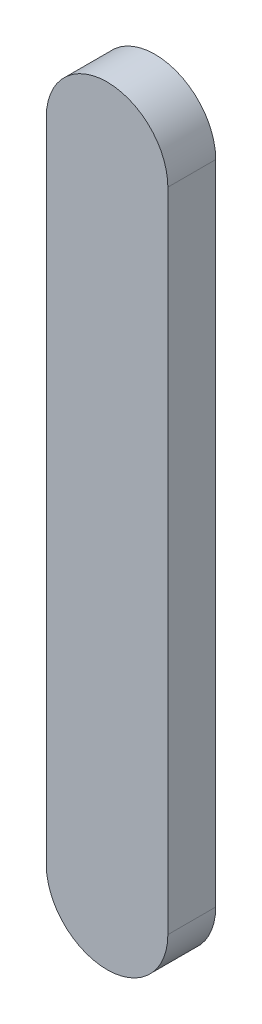
ISO-10303-21;
HEADER;
FILE_DESCRIPTION(('STEP AP214'),'2;1');
FILE_NAME('part.step','',(''),(''),'','','');
FILE_SCHEMA(('AUTOMOTIVE_DESIGN { 1 0 10303 214 1 1 1 1 }'));
ENDSEC;
DATA;
#1=APPLICATION_CONTEXT('core data for automotive mechanical design processes');
#2=APPLICATION_PROTOCOL_DEFINITION('international standard','automotive_design',2000,#1);
#3=PRODUCT_CONTEXT('',#1,'mechanical');
#4=PRODUCT('Part','Part','',(#3));
#5=PRODUCT_RELATED_PRODUCT_CATEGORY('part','',(#4));
#6=PRODUCT_DEFINITION_FORMATION('','',#4);
#7=PRODUCT_DEFINITION_CONTEXT('part definition',#1,'design');
#8=PRODUCT_DEFINITION('design','',#6,#7);
#9=PRODUCT_DEFINITION_SHAPE('','',#8);
#10=(LENGTH_UNIT() NAMED_UNIT(*) SI_UNIT(.MILLI.,.METRE.));
#11=(NAMED_UNIT(*) PLANE_ANGLE_UNIT() SI_UNIT($,.RADIAN.));
#12=(NAMED_UNIT(*) SI_UNIT($,.STERADIAN.) SOLID_ANGLE_UNIT());
#13=UNCERTAINTY_MEASURE_WITH_UNIT(LENGTH_MEASURE(1.E-05),#10,'distance_accuracy_value','');
#14=(GEOMETRIC_REPRESENTATION_CONTEXT(3) GLOBAL_UNCERTAINTY_ASSIGNED_CONTEXT((#13)) GLOBAL_UNIT_ASSIGNED_CONTEXT((#10,
#11,#12)) REPRESENTATION_CONTEXT('',''));
#15=CARTESIAN_POINT('',(0.,0.,0.));
#16=DIRECTION('',(0.,0.,1.));
#17=DIRECTION('',(1.,0.,0.));
#18=AXIS2_PLACEMENT_3D('',#15,#16,#17);
#19=CARTESIAN_POINT('',(131.6228,74.8219992,0.));
#20=DIRECTION('',(-1.,0.,0.));
#21=DIRECTION('',(0.,1.,0.));
#22=AXIS2_PLACEMENT_3D('',#19,#20,#21);
#23=PLANE('',#22);
#24=DIRECTION('',(0.,1.,0.));
#25=VECTOR('',#24,1.);
#26=CARTESIAN_POINT('',(131.6228,74.8219992,0.1999996));
#27=LINE('',#26,#25);
#28=CARTESIAN_POINT('',(131.6228,74.8219992,0.1999996));
#29=VERTEX_POINT('',#28);
#30=CARTESIAN_POINT('',(131.6228,77.526896,0.1999996));
#31=VERTEX_POINT('',#30);
#32=EDGE_CURVE('E11',#29,#31,#27,.T.);
#33=ORIENTED_EDGE('',*,*,#32,.F.);
#34=DIRECTION('',(0.,0.,1.));
#35=VECTOR('',#34,1.);
#36=CARTESIAN_POINT('',(131.6228,74.8219992,0.));
#37=LINE('',#36,#35);
#38=CARTESIAN_POINT('',(131.6228,74.8219992,0.));
#39=VERTEX_POINT('',#38);
#40=EDGE_CURVE('E24',#39,#29,#37,.T.);
#41=ORIENTED_EDGE('',*,*,#40,.F.);
#42=DIRECTION('',(0.,1.,0.));
#43=VECTOR('',#42,1.);
#44=CARTESIAN_POINT('',(131.6228,74.8219992,0.));
#45=LINE('',#44,#43);
#46=CARTESIAN_POINT('',(131.6228,77.526896,0.));
#47=VERTEX_POINT('',#46);
#48=EDGE_CURVE('E75',#39,#47,#45,.T.);
#49=ORIENTED_EDGE('',*,*,#48,.T.);
#50=DIRECTION('',(0.,0.,1.));
#51=VECTOR('',#50,1.);
#52=CARTESIAN_POINT('',(131.6228,77.526896,0.));
#53=LINE('',#52,#51);
#54=EDGE_CURVE('E37',#47,#31,#53,.T.);
#55=ORIENTED_EDGE('',*,*,#54,.T.);
#56=EDGE_LOOP('',(#33,#41,#49,#55));
#57=FACE_BOUND('',#56,.T.);
#58=ADVANCED_FACE('F17',(#57),#23,.F.);
#59=CARTESIAN_POINT('',(131.3688,77.526896,0.));
#60=DIRECTION('',(0.,0.,-1.));
#61=DIRECTION('',(1.,0.,0.));
#62=AXIS2_PLACEMENT_3D('',#59,#60,#61);
#63=CYLINDRICAL_SURFACE('',#62,0.254);
#64=CARTESIAN_POINT('',(131.3688,77.526896,0.1999996));
#65=DIRECTION('',(0.,0.,1.));
#66=DIRECTION('',(1.,0.,0.));
#67=AXIS2_PLACEMENT_3D('',#64,#65,#66);
#68=CIRCLE('',#67,0.254);
#69=CARTESIAN_POINT('',(131.1148,77.526896,0.1999996));
#70=VERTEX_POINT('',#69);
#71=EDGE_CURVE('E83',#31,#70,#68,.T.);
#72=ORIENTED_EDGE('',*,*,#71,.F.);
#73=ORIENTED_EDGE('',*,*,#54,.F.);
#74=CARTESIAN_POINT('',(131.3688,77.526896,0.));
#75=DIRECTION('',(0.,0.,1.));
#76=DIRECTION('',(1.,0.,0.));
#77=AXIS2_PLACEMENT_3D('',#74,#75,#76);
#78=CIRCLE('',#77,0.254);
#79=CARTESIAN_POINT('',(131.1148,77.526896,0.));
#80=VERTEX_POINT('',#79);
#81=EDGE_CURVE('E81',#47,#80,#78,.T.);
#82=ORIENTED_EDGE('',*,*,#81,.T.);
#83=DIRECTION('',(0.,0.,1.));
#84=VECTOR('',#83,1.);
#85=CARTESIAN_POINT('',(131.1148,77.526896,0.));
#86=LINE('',#85,#84);
#87=EDGE_CURVE('E67',#80,#70,#86,.T.);
#88=ORIENTED_EDGE('',*,*,#87,.T.);
#89=EDGE_LOOP('',(#72,#73,#82,#88));
#90=FACE_BOUND('',#89,.T.);
#91=ADVANCED_FACE('F89',(#90),#63,.T.);
#92=CARTESIAN_POINT('',(131.1148,77.526896,0.));
#93=DIRECTION('',(1.,0.,0.));
#94=DIRECTION('',(0.,-1.,0.));
#95=AXIS2_PLACEMENT_3D('',#92,#93,#94);
#96=PLANE('',#95);
#97=DIRECTION('',(0.,-1.,0.));
#98=VECTOR('',#97,1.);
#99=CARTESIAN_POINT('',(131.1148,77.526896,0.1999996));
#100=LINE('',#99,#98);
#101=CARTESIAN_POINT('',(131.1148,74.8219992,0.1999996));
#102=VERTEX_POINT('',#101);
#103=EDGE_CURVE('E71',#70,#102,#100,.T.);
#104=ORIENTED_EDGE('',*,*,#103,.F.);
#105=ORIENTED_EDGE('',*,*,#87,.F.);
#106=DIRECTION('',(0.,-1.,0.));
#107=VECTOR('',#106,1.);
#108=CARTESIAN_POINT('',(131.1148,77.526896,0.));
#109=LINE('',#108,#107);
#110=CARTESIAN_POINT('',(131.1148,74.8219992,0.));
#111=VERTEX_POINT('',#110);
#112=EDGE_CURVE('E63',#80,#111,#109,.T.);
#113=ORIENTED_EDGE('',*,*,#112,.T.);
#114=DIRECTION('',(0.,0.,1.));
#115=VECTOR('',#114,1.);
#116=CARTESIAN_POINT('',(131.1148,74.8219992,0.));
#117=LINE('',#116,#115);
#118=EDGE_CURVE('E53',#111,#102,#117,.T.);
#119=ORIENTED_EDGE('',*,*,#118,.T.);
#120=EDGE_LOOP('',(#104,#105,#113,#119));
#121=FACE_BOUND('',#120,.T.);
#122=ADVANCED_FACE('F66',(#121),#96,.F.);
#123=CARTESIAN_POINT('',(131.3688,74.8219992,0.));
#124=DIRECTION('',(0.,0.,-1.));
#125=DIRECTION('',(-1.,0.,0.));
#126=AXIS2_PLACEMENT_3D('',#123,#124,#125);
#127=CYLINDRICAL_SURFACE('',#126,0.254);
#128=CARTESIAN_POINT('',(131.3688,74.8219992,0.1999996));
#129=DIRECTION('',(0.,0.,1.));
#130=DIRECTION('',(-1.,0.,0.));
#131=AXIS2_PLACEMENT_3D('',#128,#129,#130);
#132=CIRCLE('',#131,0.254);
#133=EDGE_CURVE('E59',#102,#29,#132,.T.);
#134=ORIENTED_EDGE('',*,*,#133,.F.);
#135=ORIENTED_EDGE('',*,*,#118,.F.);
#136=CARTESIAN_POINT('',(131.3688,74.8219992,0.));
#137=DIRECTION('',(0.,0.,1.));
#138=DIRECTION('',(-1.,0.,0.));
#139=AXIS2_PLACEMENT_3D('',#136,#137,#138);
#140=CIRCLE('',#139,0.254);
#141=EDGE_CURVE('E57',#111,#39,#140,.T.);
#142=ORIENTED_EDGE('',*,*,#141,.T.);
#143=ORIENTED_EDGE('',*,*,#40,.T.);
#144=EDGE_LOOP('',(#134,#135,#142,#143));
#145=FACE_BOUND('',#144,.T.);
#146=ADVANCED_FACE('F55',(#145),#127,.T.);
#147=CARTESIAN_POINT('',(131.6228,74.8219992,0.));
#148=DIRECTION('',(0.,0.,-1.));
#149=DIRECTION('',(-1.,0.,0.));
#150=AXIS2_PLACEMENT_3D('',#147,#148,#149);
#151=PLANE('',#150);
#152=ORIENTED_EDGE('',*,*,#141,.F.);
#153=ORIENTED_EDGE('',*,*,#112,.F.);
#154=ORIENTED_EDGE('',*,*,#81,.F.);
#155=ORIENTED_EDGE('',*,*,#48,.F.);
#156=EDGE_LOOP('',(#152,#153,#154,#155));
#157=FACE_BOUND('',#156,.T.);
#158=ADVANCED_FACE('F74',(#157),#151,.T.);
#159=CARTESIAN_POINT('',(131.6228,74.8219992,0.1999996));
#160=DIRECTION('',(0.,0.,-1.));
#161=DIRECTION('',(-1.,0.,0.));
#162=AXIS2_PLACEMENT_3D('',#159,#160,#161);
#163=PLANE('',#162);
#164=ORIENTED_EDGE('',*,*,#32,.T.);
#165=ORIENTED_EDGE('',*,*,#71,.T.);
#166=ORIENTED_EDGE('',*,*,#103,.T.);
#167=ORIENTED_EDGE('',*,*,#133,.T.);
#168=EDGE_LOOP('',(#164,#165,#166,#167));
#169=FACE_BOUND('',#168,.T.);
#170=ADVANCED_FACE('F91',(#169),#163,.F.);
#171=CLOSED_SHELL('',(#58,#91,#122,#146,#158,#170));
#172=MANIFOLD_SOLID_BREP('B1',#171);
#173=ADVANCED_BREP_SHAPE_REPRESENTATION('',(#18,#172),#14);
#174=SHAPE_DEFINITION_REPRESENTATION(#9,#173);
ENDSEC;
END-ISO-10303-21;
